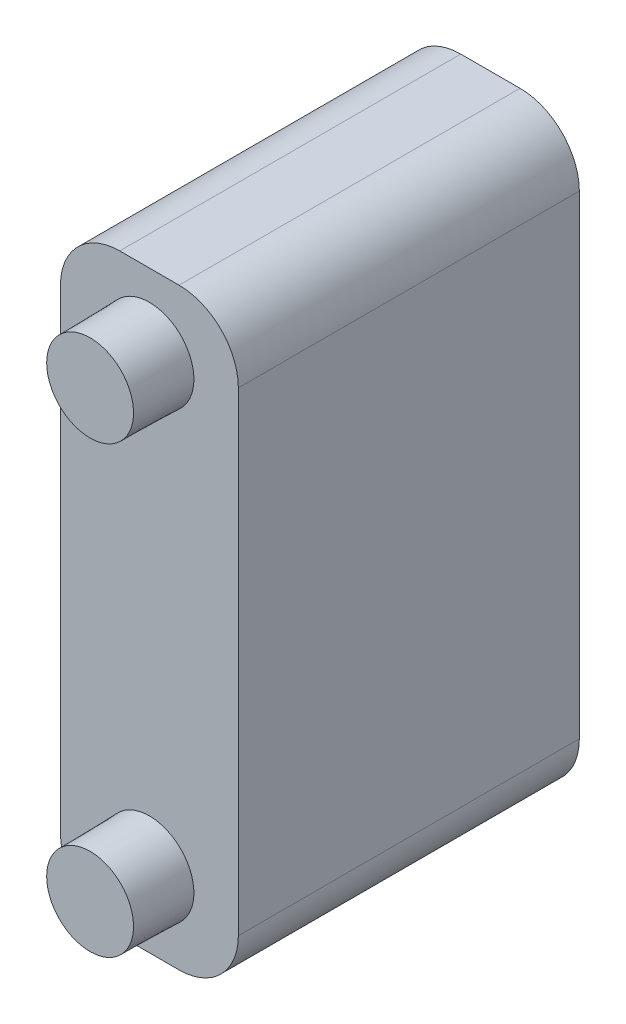
ISO-10303-21;
HEADER;
FILE_DESCRIPTION(('STEP AP214'),'2;1');
FILE_NAME('part.step','',(''),(''),'','','');
FILE_SCHEMA(('AUTOMOTIVE_DESIGN { 1 0 10303 214 1 1 1 1 }'));
ENDSEC;
DATA;
#1=APPLICATION_CONTEXT('core data for automotive mechanical design processes');
#2=APPLICATION_PROTOCOL_DEFINITION('international standard','automotive_design',2000,#1);
#3=PRODUCT_CONTEXT('',#1,'mechanical');
#4=PRODUCT('Part','Part','',(#3));
#5=PRODUCT_RELATED_PRODUCT_CATEGORY('part','',(#4));
#6=PRODUCT_DEFINITION_FORMATION('','',#4);
#7=PRODUCT_DEFINITION_CONTEXT('part definition',#1,'design');
#8=PRODUCT_DEFINITION('design','',#6,#7);
#9=PRODUCT_DEFINITION_SHAPE('','',#8);
#10=(LENGTH_UNIT() NAMED_UNIT(*) SI_UNIT(.MILLI.,.METRE.));
#11=(NAMED_UNIT(*) PLANE_ANGLE_UNIT() SI_UNIT($,.RADIAN.));
#12=(NAMED_UNIT(*) SI_UNIT($,.STERADIAN.) SOLID_ANGLE_UNIT());
#13=UNCERTAINTY_MEASURE_WITH_UNIT(LENGTH_MEASURE(1.E-05),#10,'distance_accuracy_value','');
#14=(GEOMETRIC_REPRESENTATION_CONTEXT(3) GLOBAL_UNCERTAINTY_ASSIGNED_CONTEXT((#13)) GLOBAL_UNIT_ASSIGNED_CONTEXT((#10,
#11,#12)) REPRESENTATION_CONTEXT('',''));
#15=CARTESIAN_POINT('',(0.,0.,0.));
#16=DIRECTION('',(0.,0.,1.));
#17=DIRECTION('',(1.,0.,0.));
#18=AXIS2_PLACEMENT_3D('',#15,#16,#17);
#19=CARTESIAN_POINT('',(-2.,2.,11.5));
#20=DIRECTION('',(0.,0.,-1.));
#21=DIRECTION('',(-1.,0.,0.));
#22=AXIS2_PLACEMENT_3D('',#19,#20,#21);
#23=CYLINDRICAL_SURFACE('',#22,2.);
#24=CARTESIAN_POINT('',(-2.,2.,0.));
#25=DIRECTION('',(0.,0.,-1.));
#26=DIRECTION('',(-1.,0.,0.));
#27=AXIS2_PLACEMENT_3D('',#24,#25,#26);
#28=CIRCLE('',#27,2.);
#29=CARTESIAN_POINT('',(0.,2.00000000000001,0.));
#30=VERTEX_POINT('',#29);
#31=CARTESIAN_POINT('',(-2.00000000000001,0.,0.));
#32=VERTEX_POINT('',#31);
#33=EDGE_CURVE('E140',#30,#32,#28,.T.);
#34=ORIENTED_EDGE('',*,*,#33,.F.);
#35=DIRECTION('',(0.,0.,-1.));
#36=VECTOR('',#35,1.);
#37=CARTESIAN_POINT('',(0.,2.00000000000001,11.5));
#38=LINE('',#37,#36);
#39=CARTESIAN_POINT('',(0.,2.00000000000001,11.5));
#40=VERTEX_POINT('',#39);
#41=EDGE_CURVE('E11',#40,#30,#38,.T.);
#42=ORIENTED_EDGE('',*,*,#41,.F.);
#43=CARTESIAN_POINT('',(-2.,2.,11.5));
#44=DIRECTION('',(0.,0.,-1.));
#45=DIRECTION('',(-1.,0.,0.));
#46=AXIS2_PLACEMENT_3D('',#43,#44,#45);
#47=CIRCLE('',#46,2.);
#48=CARTESIAN_POINT('',(-2.00000000000001,0.,11.5));
#49=VERTEX_POINT('',#48);
#50=EDGE_CURVE('E159',#40,#49,#47,.T.);
#51=ORIENTED_EDGE('',*,*,#50,.T.);
#52=DIRECTION('',(0.,0.,-1.));
#53=VECTOR('',#52,1.);
#54=CARTESIAN_POINT('',(-2.00000000000001,0.,11.5));
#55=LINE('',#54,#53);
#56=EDGE_CURVE('E44',#49,#32,#55,.T.);
#57=ORIENTED_EDGE('',*,*,#56,.T.);
#58=EDGE_LOOP('',(#34,#42,#51,#57));
#59=FACE_BOUND('',#58,.T.);
#60=ADVANCED_FACE('F41',(#59),#23,.T.);
#61=CARTESIAN_POINT('',(0.,2.00000000000001,11.5));
#62=DIRECTION('',(-1.,0.,0.));
#63=DIRECTION('',(0.,0.,1.));
#64=AXIS2_PLACEMENT_3D('',#61,#62,#63);
#65=PLANE('',#64);
#66=DIRECTION('',(0.,1.,0.));
#67=VECTOR('',#66,1.);
#68=CARTESIAN_POINT('',(0.,2.00000000000001,0.));
#69=LINE('',#68,#67);
#70=CARTESIAN_POINT('',(0.,18.,0.));
#71=VERTEX_POINT('',#70);
#72=EDGE_CURVE('E86',#30,#71,#69,.T.);
#73=ORIENTED_EDGE('',*,*,#72,.T.);
#74=DIRECTION('',(0.,0.,-1.));
#75=VECTOR('',#74,1.);
#76=CARTESIAN_POINT('',(0.,18.,11.5));
#77=LINE('',#76,#75);
#78=CARTESIAN_POINT('',(0.,18.,11.5));
#79=VERTEX_POINT('',#78);
#80=EDGE_CURVE('E50',#79,#71,#77,.T.);
#81=ORIENTED_EDGE('',*,*,#80,.F.);
#82=DIRECTION('',(0.,1.,0.));
#83=VECTOR('',#82,1.);
#84=CARTESIAN_POINT('',(0.,2.00000000000001,11.5));
#85=LINE('',#84,#83);
#86=EDGE_CURVE('E118',#40,#79,#85,.T.);
#87=ORIENTED_EDGE('',*,*,#86,.F.);
#88=ORIENTED_EDGE('',*,*,#41,.T.);
#89=EDGE_LOOP('',(#73,#81,#87,#88));
#90=FACE_BOUND('',#89,.T.);
#91=ADVANCED_FACE('F218',(#90),#65,.F.);
#92=CARTESIAN_POINT('',(-2.,18.,11.5));
#93=DIRECTION('',(0.,0.,-1.));
#94=DIRECTION('',(-1.,0.,0.));
#95=AXIS2_PLACEMENT_3D('',#92,#93,#94);
#96=CYLINDRICAL_SURFACE('',#95,2.);
#97=CARTESIAN_POINT('',(-2.,18.,0.));
#98=DIRECTION('',(0.,0.,1.));
#99=DIRECTION('',(1.,0.,0.));
#100=AXIS2_PLACEMENT_3D('',#97,#98,#99);
#101=CIRCLE('',#100,2.);
#102=CARTESIAN_POINT('',(-2.00000000000001,20.,0.));
#103=VERTEX_POINT('',#102);
#104=EDGE_CURVE('E125',#71,#103,#101,.T.);
#105=ORIENTED_EDGE('',*,*,#104,.T.);
#106=DIRECTION('',(0.,0.,-1.));
#107=VECTOR('',#106,1.);
#108=CARTESIAN_POINT('',(-2.00000000000001,20.,11.5));
#109=LINE('',#108,#107);
#110=CARTESIAN_POINT('',(-2.00000000000001,20.,11.5));
#111=VERTEX_POINT('',#110);
#112=EDGE_CURVE('E122',#111,#103,#109,.T.);
#113=ORIENTED_EDGE('',*,*,#112,.F.);
#114=CARTESIAN_POINT('',(-2.,18.,11.5));
#115=DIRECTION('',(0.,0.,1.));
#116=DIRECTION('',(1.,0.,0.));
#117=AXIS2_PLACEMENT_3D('',#114,#115,#116);
#118=CIRCLE('',#117,2.);
#119=EDGE_CURVE('E110',#79,#111,#118,.T.);
#120=ORIENTED_EDGE('',*,*,#119,.F.);
#121=ORIENTED_EDGE('',*,*,#80,.T.);
#122=EDGE_LOOP('',(#105,#113,#120,#121));
#123=FACE_BOUND('',#122,.T.);
#124=ADVANCED_FACE('F123',(#123),#96,.T.);
#125=CARTESIAN_POINT('',(-2.00000000000001,20.,11.5));
#126=DIRECTION('',(0.,-1.,0.));
#127=DIRECTION('',(0.,0.,-1.));
#128=AXIS2_PLACEMENT_3D('',#125,#126,#127);
#129=PLANE('',#128);
#130=DIRECTION('',(-1.,0.,0.));
#131=VECTOR('',#130,1.);
#132=CARTESIAN_POINT('',(-2.00000000000001,20.,0.));
#133=LINE('',#132,#131);
#134=CARTESIAN_POINT('',(-3.99999999999999,20.,0.));
#135=VERTEX_POINT('',#134);
#136=EDGE_CURVE('E156',#103,#135,#133,.T.);
#137=ORIENTED_EDGE('',*,*,#136,.T.);
#138=DIRECTION('',(0.,0.,-1.));
#139=VECTOR('',#138,1.);
#140=CARTESIAN_POINT('',(-3.99999999999999,20.,11.5));
#141=LINE('',#140,#139);
#142=CARTESIAN_POINT('',(-3.99999999999999,20.,11.5));
#143=VERTEX_POINT('',#142);
#144=EDGE_CURVE('E129',#143,#135,#141,.T.);
#145=ORIENTED_EDGE('',*,*,#144,.F.);
#146=DIRECTION('',(-1.,0.,0.));
#147=VECTOR('',#146,1.);
#148=CARTESIAN_POINT('',(-2.00000000000001,20.,11.5));
#149=LINE('',#148,#147);
#150=EDGE_CURVE('E116',#111,#143,#149,.T.);
#151=ORIENTED_EDGE('',*,*,#150,.F.);
#152=ORIENTED_EDGE('',*,*,#112,.T.);
#153=EDGE_LOOP('',(#137,#145,#151,#152));
#154=FACE_BOUND('',#153,.T.);
#155=ADVANCED_FACE('F131',(#154),#129,.F.);
#156=CARTESIAN_POINT('',(-4.,18.,11.5));
#157=DIRECTION('',(0.,0.,-1.));
#158=DIRECTION('',(-1.,0.,0.));
#159=AXIS2_PLACEMENT_3D('',#156,#157,#158);
#160=CYLINDRICAL_SURFACE('',#159,2.);
#161=CARTESIAN_POINT('',(-4.,18.,0.));
#162=DIRECTION('',(0.,0.,-1.));
#163=DIRECTION('',(-1.,0.,0.));
#164=AXIS2_PLACEMENT_3D('',#161,#162,#163);
#165=CIRCLE('',#164,2.);
#166=CARTESIAN_POINT('',(-6.,18.,0.));
#167=VERTEX_POINT('',#166);
#168=EDGE_CURVE('E153',#167,#135,#165,.T.);
#169=ORIENTED_EDGE('',*,*,#168,.F.);
#170=DIRECTION('',(0.,0.,-1.));
#171=VECTOR('',#170,1.);
#172=CARTESIAN_POINT('',(-6.,18.,11.5));
#173=LINE('',#172,#171);
#174=CARTESIAN_POINT('',(-6.,18.,11.5));
#175=VERTEX_POINT('',#174);
#176=EDGE_CURVE('E163',#175,#167,#173,.T.);
#177=ORIENTED_EDGE('',*,*,#176,.F.);
#178=CARTESIAN_POINT('',(-4.,18.,11.5));
#179=DIRECTION('',(0.,0.,-1.));
#180=DIRECTION('',(-1.,0.,0.));
#181=AXIS2_PLACEMENT_3D('',#178,#179,#180);
#182=CIRCLE('',#181,2.);
#183=EDGE_CURVE('E133',#175,#143,#182,.T.);
#184=ORIENTED_EDGE('',*,*,#183,.T.);
#185=ORIENTED_EDGE('',*,*,#144,.T.);
#186=EDGE_LOOP('',(#169,#177,#184,#185));
#187=FACE_BOUND('',#186,.T.);
#188=ADVANCED_FACE('F174',(#187),#160,.T.);
#189=CARTESIAN_POINT('',(-6.,2.00000000000001,11.5));
#190=DIRECTION('',(-1.,0.,0.));
#191=DIRECTION('',(0.,0.,1.));
#192=AXIS2_PLACEMENT_3D('',#189,#190,#191);
#193=PLANE('',#192);
#194=DIRECTION('',(0.,1.,0.));
#195=VECTOR('',#194,1.);
#196=CARTESIAN_POINT('',(-6.,2.00000000000001,0.));
#197=LINE('',#196,#195);
#198=CARTESIAN_POINT('',(-6.,2.00000000000001,0.));
#199=VERTEX_POINT('',#198);
#200=EDGE_CURVE('E150',#199,#167,#197,.T.);
#201=ORIENTED_EDGE('',*,*,#200,.F.);
#202=DIRECTION('',(0.,0.,-1.));
#203=VECTOR('',#202,1.);
#204=CARTESIAN_POINT('',(-6.,2.00000000000001,11.5));
#205=LINE('',#204,#203);
#206=CARTESIAN_POINT('',(-6.,2.00000000000001,11.5));
#207=VERTEX_POINT('',#206);
#208=EDGE_CURVE('E165',#207,#199,#205,.T.);
#209=ORIENTED_EDGE('',*,*,#208,.F.);
#210=DIRECTION('',(0.,1.,0.));
#211=VECTOR('',#210,1.);
#212=CARTESIAN_POINT('',(-6.,2.00000000000001,11.5));
#213=LINE('',#212,#211);
#214=EDGE_CURVE('E135',#207,#175,#213,.T.);
#215=ORIENTED_EDGE('',*,*,#214,.T.);
#216=ORIENTED_EDGE('',*,*,#176,.T.);
#217=EDGE_LOOP('',(#201,#209,#215,#216));
#218=FACE_BOUND('',#217,.T.);
#219=ADVANCED_FACE('F180',(#218),#193,.T.);
#220=CARTESIAN_POINT('',(-4.,2.,11.5));
#221=DIRECTION('',(0.,0.,-1.));
#222=DIRECTION('',(-1.,0.,0.));
#223=AXIS2_PLACEMENT_3D('',#220,#221,#222);
#224=CYLINDRICAL_SURFACE('',#223,2.);
#225=CARTESIAN_POINT('',(-4.,2.,0.));
#226=DIRECTION('',(0.,0.,-1.));
#227=DIRECTION('',(-1.,0.,0.));
#228=AXIS2_PLACEMENT_3D('',#225,#226,#227);
#229=CIRCLE('',#228,2.);
#230=CARTESIAN_POINT('',(-3.99999999999999,0.,0.));
#231=VERTEX_POINT('',#230);
#232=EDGE_CURVE('E147',#231,#199,#229,.T.);
#233=ORIENTED_EDGE('',*,*,#232,.F.);
#234=DIRECTION('',(0.,0.,-1.));
#235=VECTOR('',#234,1.);
#236=CARTESIAN_POINT('',(-3.99999999999999,0.,11.5));
#237=LINE('',#236,#235);
#238=CARTESIAN_POINT('',(-3.99999999999999,0.,11.5));
#239=VERTEX_POINT('',#238);
#240=EDGE_CURVE('E166',#239,#231,#237,.T.);
#241=ORIENTED_EDGE('',*,*,#240,.F.);
#242=CARTESIAN_POINT('',(-4.,2.,11.5));
#243=DIRECTION('',(0.,0.,-1.));
#244=DIRECTION('',(-1.,0.,0.));
#245=AXIS2_PLACEMENT_3D('',#242,#243,#244);
#246=CIRCLE('',#245,2.);
#247=EDGE_CURVE('E181',#239,#207,#246,.T.);
#248=ORIENTED_EDGE('',*,*,#247,.T.);
#249=ORIENTED_EDGE('',*,*,#208,.T.);
#250=EDGE_LOOP('',(#233,#241,#248,#249));
#251=FACE_BOUND('',#250,.T.);
#252=ADVANCED_FACE('F236',(#251),#224,.T.);
#253=CARTESIAN_POINT('',(-2.00000000000001,0.,11.5));
#254=DIRECTION('',(0.,-1.,0.));
#255=DIRECTION('',(0.,0.,-1.));
#256=AXIS2_PLACEMENT_3D('',#253,#254,#255);
#257=PLANE('',#256);
#258=DIRECTION('',(-1.,0.,0.));
#259=VECTOR('',#258,1.);
#260=CARTESIAN_POINT('',(-2.00000000000001,0.,0.));
#261=LINE('',#260,#259);
#262=EDGE_CURVE('E143',#32,#231,#261,.T.);
#263=ORIENTED_EDGE('',*,*,#262,.F.);
#264=ORIENTED_EDGE('',*,*,#56,.F.);
#265=DIRECTION('',(-1.,0.,0.));
#266=VECTOR('',#265,1.);
#267=CARTESIAN_POINT('',(-2.00000000000001,0.,11.5));
#268=LINE('',#267,#266);
#269=EDGE_CURVE('E182',#49,#239,#268,.T.);
#270=ORIENTED_EDGE('',*,*,#269,.T.);
#271=ORIENTED_EDGE('',*,*,#240,.T.);
#272=EDGE_LOOP('',(#263,#264,#270,#271));
#273=FACE_BOUND('',#272,.T.);
#274=ADVANCED_FACE('F168',(#273),#257,.T.);
#275=CARTESIAN_POINT('',(-2.,2.,11.5));
#276=DIRECTION('',(0.,0.,-1.));
#277=DIRECTION('',(-1.,0.,0.));
#278=AXIS2_PLACEMENT_3D('',#275,#276,#277);
#279=PLANE('',#278);
#280=CARTESIAN_POINT('',(-3.,2.5,11.5));
#281=DIRECTION('',(0.,0.,-1.));
#282=DIRECTION('',(-1.,0.,0.));
#283=AXIS2_PLACEMENT_3D('',#280,#281,#282);
#284=CIRCLE('',#283,1.5);
#285=CARTESIAN_POINT('',(-4.5,2.5,11.5));
#286=VERTEX_POINT('',#285);
#287=EDGE_CURVE('E190',#286,#286,#284,.T.);
#288=ORIENTED_EDGE('',*,*,#287,.T.);
#289=EDGE_LOOP('',(#288));
#290=FACE_BOUND('',#289,.T.);
#291=CARTESIAN_POINT('',(-3.,17.5,11.5));
#292=DIRECTION('',(0.,0.,-1.));
#293=DIRECTION('',(-1.,0.,0.));
#294=AXIS2_PLACEMENT_3D('',#291,#292,#293);
#295=CIRCLE('',#294,1.5);
#296=CARTESIAN_POINT('',(-4.5,17.5,11.5));
#297=VERTEX_POINT('',#296);
#298=EDGE_CURVE('E187',#297,#297,#295,.T.);
#299=ORIENTED_EDGE('',*,*,#298,.T.);
#300=EDGE_LOOP('',(#299));
#301=FACE_BOUND('',#300,.T.);
#302=ORIENTED_EDGE('',*,*,#50,.F.);
#303=ORIENTED_EDGE('',*,*,#86,.T.);
#304=ORIENTED_EDGE('',*,*,#119,.T.);
#305=ORIENTED_EDGE('',*,*,#150,.T.);
#306=ORIENTED_EDGE('',*,*,#183,.F.);
#307=ORIENTED_EDGE('',*,*,#214,.F.);
#308=ORIENTED_EDGE('',*,*,#247,.F.);
#309=ORIENTED_EDGE('',*,*,#269,.F.);
#310=EDGE_LOOP('',(#302,#303,#304,#305,#306,#307,#308,#309));
#311=FACE_BOUND('',#310,.T.);
#312=ADVANCED_FACE('F113',(#290,#301,#311),#279,.F.);
#313=CARTESIAN_POINT('',(-2.,2.,0.));
#314=DIRECTION('',(0.,0.,-1.));
#315=DIRECTION('',(-1.,0.,0.));
#316=AXIS2_PLACEMENT_3D('',#313,#314,#315);
#317=PLANE('',#316);
#318=ORIENTED_EDGE('',*,*,#33,.T.);
#319=ORIENTED_EDGE('',*,*,#262,.T.);
#320=ORIENTED_EDGE('',*,*,#232,.T.);
#321=ORIENTED_EDGE('',*,*,#200,.T.);
#322=ORIENTED_EDGE('',*,*,#168,.T.);
#323=ORIENTED_EDGE('',*,*,#136,.F.);
#324=ORIENTED_EDGE('',*,*,#104,.F.);
#325=ORIENTED_EDGE('',*,*,#72,.F.);
#326=EDGE_LOOP('',(#318,#319,#320,#321,#322,#323,#324,#325));
#327=FACE_BOUND('',#326,.T.);
#328=ADVANCED_FACE('F170',(#327),#317,.T.);
#329=CARTESIAN_POINT('',(-3.,17.5,11.5));
#330=DIRECTION('',(0.,0.,-1.));
#331=DIRECTION('',(-1.,0.,0.));
#332=AXIS2_PLACEMENT_3D('',#329,#330,#331);
#333=CONICAL_SURFACE('',#332,1.5,0.0174532925199433);
#334=CARTESIAN_POINT('',(-3.,17.5,13.5));
#335=DIRECTION('',(0.,0.,-1.));
#336=DIRECTION('',(-1.,0.,0.));
#337=AXIS2_PLACEMENT_3D('',#334,#335,#336);
#338=CIRCLE('',#337,1.46508987014357);
#339=CARTESIAN_POINT('',(-4.46508987014357,17.5,13.5));
#340=VERTEX_POINT('',#339);
#341=EDGE_CURVE('E191',#340,#340,#338,.T.);
#342=ORIENTED_EDGE('',*,*,#341,.T.);
#343=EDGE_LOOP('',(#342));
#344=FACE_BOUND('',#343,.T.);
#345=ORIENTED_EDGE('',*,*,#298,.F.);
#346=EDGE_LOOP('',(#345));
#347=FACE_BOUND('',#346,.T.);
#348=ADVANCED_FACE('F213',(#344,#347),#333,.T.);
#349=CARTESIAN_POINT('',(-3.,17.5,13.5));
#350=DIRECTION('',(0.,0.,-1.));
#351=DIRECTION('',(-1.,0.,0.));
#352=AXIS2_PLACEMENT_3D('',#349,#350,#351);
#353=PLANE('',#352);
#354=ORIENTED_EDGE('',*,*,#341,.F.);
#355=EDGE_LOOP('',(#354));
#356=FACE_BOUND('',#355,.T.);
#357=ADVANCED_FACE('F204',(#356),#353,.F.);
#358=CARTESIAN_POINT('',(-3.,2.5,11.5));
#359=DIRECTION('',(0.,0.,-1.));
#360=DIRECTION('',(-1.,0.,0.));
#361=AXIS2_PLACEMENT_3D('',#358,#359,#360);
#362=CONICAL_SURFACE('',#361,1.5,0.0174532925199433);
#363=CARTESIAN_POINT('',(-3.,2.5,13.5));
#364=DIRECTION('',(0.,0.,-1.));
#365=DIRECTION('',(-1.,0.,0.));
#366=AXIS2_PLACEMENT_3D('',#363,#364,#365);
#367=CIRCLE('',#366,1.46508987014357);
#368=CARTESIAN_POINT('',(-4.46508987014357,2.5,13.5));
#369=VERTEX_POINT('',#368);
#370=EDGE_CURVE('E144',#369,#369,#367,.T.);
#371=ORIENTED_EDGE('',*,*,#370,.T.);
#372=EDGE_LOOP('',(#371));
#373=FACE_BOUND('',#372,.T.);
#374=ORIENTED_EDGE('',*,*,#287,.F.);
#375=EDGE_LOOP('',(#374));
#376=FACE_BOUND('',#375,.T.);
#377=ADVANCED_FACE('F201',(#373,#376),#362,.T.);
#378=CARTESIAN_POINT('',(-3.,2.5,13.5));
#379=DIRECTION('',(0.,0.,-1.));
#380=DIRECTION('',(-1.,0.,0.));
#381=AXIS2_PLACEMENT_3D('',#378,#379,#380);
#382=PLANE('',#381);
#383=ORIENTED_EDGE('',*,*,#370,.F.);
#384=EDGE_LOOP('',(#383));
#385=FACE_BOUND('',#384,.T.);
#386=ADVANCED_FACE('F203',(#385),#382,.F.);
#387=CLOSED_SHELL('',(#60,#91,#124,#155,#188,#219,#252,#274,#312,#328,#348,#357,#377,#386));
#388=MANIFOLD_SOLID_BREP('B2',#387);
#389=ADVANCED_BREP_SHAPE_REPRESENTATION('',(#18,#388),#14);
#390=SHAPE_DEFINITION_REPRESENTATION(#9,#389);
ENDSEC;
END-ISO-10303-21;
